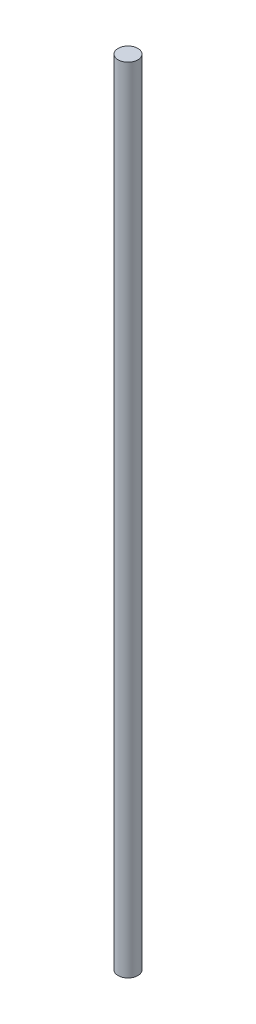
ISO-10303-21;
HEADER;
FILE_DESCRIPTION(('STEP AP214'),'2;1');
FILE_NAME('part.step','',(''),(''),'','','');
FILE_SCHEMA(('AUTOMOTIVE_DESIGN { 1 0 10303 214 1 1 1 1 }'));
ENDSEC;
DATA;
#1=APPLICATION_CONTEXT('core data for automotive mechanical design processes');
#2=APPLICATION_PROTOCOL_DEFINITION('international standard','automotive_design',2000,#1);
#3=PRODUCT_CONTEXT('',#1,'mechanical');
#4=PRODUCT('Part','Part','',(#3));
#5=PRODUCT_RELATED_PRODUCT_CATEGORY('part','',(#4));
#6=PRODUCT_DEFINITION_FORMATION('','',#4);
#7=PRODUCT_DEFINITION_CONTEXT('part definition',#1,'design');
#8=PRODUCT_DEFINITION('design','',#6,#7);
#9=PRODUCT_DEFINITION_SHAPE('','',#8);
#10=(LENGTH_UNIT() NAMED_UNIT(*) SI_UNIT(.MILLI.,.METRE.));
#11=(NAMED_UNIT(*) PLANE_ANGLE_UNIT() SI_UNIT($,.RADIAN.));
#12=(NAMED_UNIT(*) SI_UNIT($,.STERADIAN.) SOLID_ANGLE_UNIT());
#13=UNCERTAINTY_MEASURE_WITH_UNIT(LENGTH_MEASURE(1.E-05),#10,'distance_accuracy_value','');
#14=(GEOMETRIC_REPRESENTATION_CONTEXT(3) GLOBAL_UNCERTAINTY_ASSIGNED_CONTEXT((#13)) GLOBAL_UNIT_ASSIGNED_CONTEXT((#10,
#11,#12)) REPRESENTATION_CONTEXT('',''));
#15=CARTESIAN_POINT('',(0.,0.,0.));
#16=DIRECTION('',(0.,0.,1.));
#17=DIRECTION('',(1.,0.,0.));
#18=AXIS2_PLACEMENT_3D('',#15,#16,#17);
#19=CARTESIAN_POINT('',(0.,200.,0.));
#20=DIRECTION('',(0.,-1.,0.));
#21=DIRECTION('',(0.,0.,-1.));
#22=AXIS2_PLACEMENT_3D('',#19,#20,#21);
#23=CYLINDRICAL_SURFACE('',#22,2.5);
#24=CARTESIAN_POINT('',(0.,200.,0.));
#25=DIRECTION('',(0.,1.,0.));
#26=DIRECTION('',(0.,0.,1.));
#27=AXIS2_PLACEMENT_3D('',#24,#25,#26);
#28=CIRCLE('',#27,2.5);
#29=CARTESIAN_POINT('',(0.,200.,2.5));
#30=VERTEX_POINT('',#29);
#31=EDGE_CURVE('E10',#30,#30,#28,.T.);
#32=ORIENTED_EDGE('',*,*,#31,.F.);
#33=EDGE_LOOP('',(#32));
#34=FACE_BOUND('',#33,.T.);
#35=CARTESIAN_POINT('',(0.,0.,0.));
#36=DIRECTION('',(0.,1.,0.));
#37=DIRECTION('',(0.,0.,1.));
#38=AXIS2_PLACEMENT_3D('',#35,#36,#37);
#39=CIRCLE('',#38,2.5);
#40=CARTESIAN_POINT('',(0.,0.,2.5));
#41=VERTEX_POINT('',#40);
#42=EDGE_CURVE('E36',#41,#41,#39,.T.);
#43=ORIENTED_EDGE('',*,*,#42,.T.);
#44=EDGE_LOOP('',(#43));
#45=FACE_BOUND('',#44,.T.);
#46=ADVANCED_FACE('F33',(#34,#45),#23,.T.);
#47=CARTESIAN_POINT('',(0.,200.,0.));
#48=DIRECTION('',(0.,1.,0.));
#49=DIRECTION('',(0.,0.,1.));
#50=AXIS2_PLACEMENT_3D('',#47,#48,#49);
#51=PLANE('',#50);
#52=ORIENTED_EDGE('',*,*,#31,.T.);
#53=EDGE_LOOP('',(#52));
#54=FACE_BOUND('',#53,.T.);
#55=ADVANCED_FACE('F48',(#54),#51,.T.);
#56=CARTESIAN_POINT('',(0.,0.,0.));
#57=DIRECTION('',(0.,1.,0.));
#58=DIRECTION('',(0.,0.,1.));
#59=AXIS2_PLACEMENT_3D('',#56,#57,#58);
#60=PLANE('',#59);
#61=ORIENTED_EDGE('',*,*,#42,.F.);
#62=EDGE_LOOP('',(#61));
#63=FACE_BOUND('',#62,.T.);
#64=ADVANCED_FACE('F46',(#63),#60,.F.);
#65=CLOSED_SHELL('',(#46,#55,#64));
#66=MANIFOLD_SOLID_BREP('B2',#65);
#67=ADVANCED_BREP_SHAPE_REPRESENTATION('',(#18,#66),#14);
#68=SHAPE_DEFINITION_REPRESENTATION(#9,#67);
ENDSEC;
END-ISO-10303-21;
